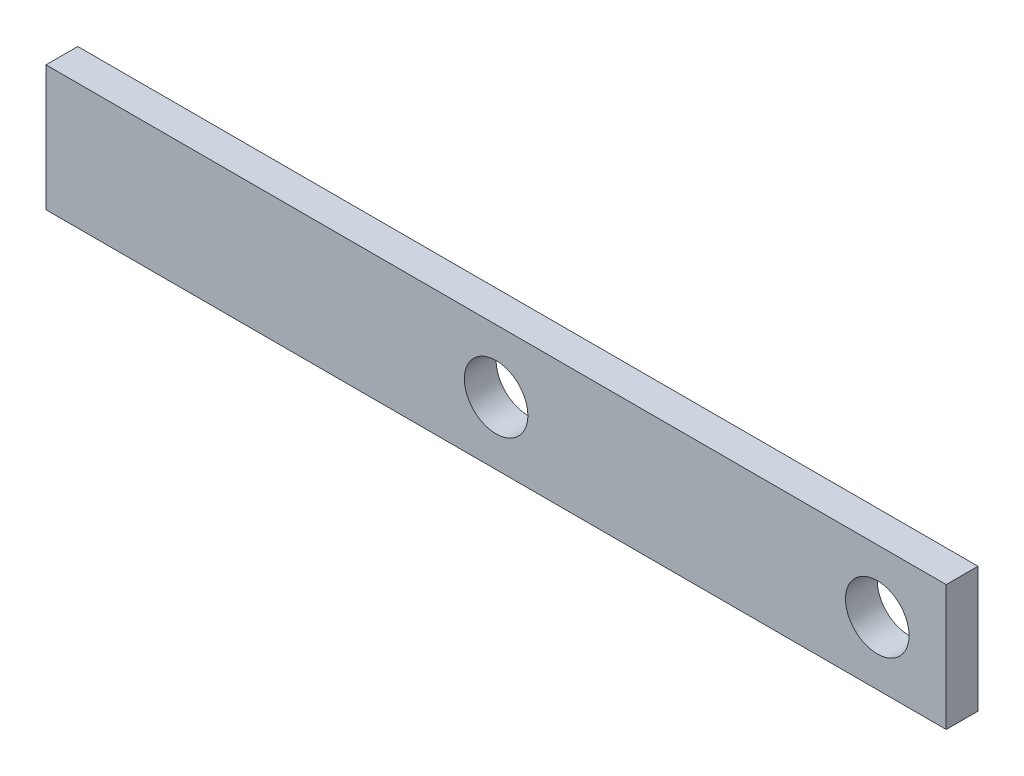
ISO-10303-21;
HEADER;
FILE_DESCRIPTION(('STEP AP214'),'2;1');
FILE_NAME('part.step','',(''),(''),'','','');
FILE_SCHEMA(('AUTOMOTIVE_DESIGN { 1 0 10303 214 1 1 1 1 }'));
ENDSEC;
DATA;
#1=APPLICATION_CONTEXT('core data for automotive mechanical design processes');
#2=APPLICATION_PROTOCOL_DEFINITION('international standard','automotive_design',2000,#1);
#3=PRODUCT_CONTEXT('',#1,'mechanical');
#4=PRODUCT('Part','Part','',(#3));
#5=PRODUCT_RELATED_PRODUCT_CATEGORY('part','',(#4));
#6=PRODUCT_DEFINITION_FORMATION('','',#4);
#7=PRODUCT_DEFINITION_CONTEXT('part definition',#1,'design');
#8=PRODUCT_DEFINITION('design','',#6,#7);
#9=PRODUCT_DEFINITION_SHAPE('','',#8);
#10=(LENGTH_UNIT() NAMED_UNIT(*) SI_UNIT(.MILLI.,.METRE.));
#11=(NAMED_UNIT(*) PLANE_ANGLE_UNIT() SI_UNIT($,.RADIAN.));
#12=(NAMED_UNIT(*) SI_UNIT($,.STERADIAN.) SOLID_ANGLE_UNIT());
#13=UNCERTAINTY_MEASURE_WITH_UNIT(LENGTH_MEASURE(1.E-05),#10,'distance_accuracy_value','');
#14=(GEOMETRIC_REPRESENTATION_CONTEXT(3) GLOBAL_UNCERTAINTY_ASSIGNED_CONTEXT((#13)) GLOBAL_UNIT_ASSIGNED_CONTEXT((#10,
#11,#12)) REPRESENTATION_CONTEXT('',''));
#15=CARTESIAN_POINT('',(0.,0.,0.));
#16=DIRECTION('',(0.,0.,1.));
#17=DIRECTION('',(1.,0.,0.));
#18=AXIS2_PLACEMENT_3D('',#15,#16,#17);
#19=CARTESIAN_POINT('',(0.,0.,10.));
#20=DIRECTION('',(0.,0.,1.));
#21=DIRECTION('',(1.,0.,0.));
#22=AXIS2_PLACEMENT_3D('',#19,#20,#21);
#23=PLANE('',#22);
#24=CARTESIAN_POINT('',(0.,0.,10.));
#25=DIRECTION('',(0.,0.,1.));
#26=DIRECTION('',(1.,0.,0.));
#27=AXIS2_PLACEMENT_3D('',#24,#25,#26);
#28=CIRCLE('',#27,10.);
#29=CARTESIAN_POINT('',(10.,0.,10.));
#30=VERTEX_POINT('',#29);
#31=EDGE_CURVE('E100',#30,#30,#28,.T.);
#32=ORIENTED_EDGE('',*,*,#31,.F.);
#33=EDGE_LOOP('',(#32));
#34=FACE_BOUND('',#33,.T.);
#35=DIRECTION('',(0.,1.,0.));
#36=VECTOR('',#35,1.);
#37=CARTESIAN_POINT('',(141.706502184528,19.7562751649105,10.));
#38=LINE('',#37,#36);
#39=CARTESIAN_POINT('',(141.706502184528,-19.7562751649105,10.));
#40=VERTEX_POINT('',#39);
#41=CARTESIAN_POINT('',(141.706502184528,19.7562751649105,10.));
#42=VERTEX_POINT('',#41);
#43=EDGE_CURVE('E85',#40,#42,#38,.T.);
#44=ORIENTED_EDGE('',*,*,#43,.T.);
#45=DIRECTION('',(-1.,0.,0.));
#46=VECTOR('',#45,1.);
#47=CARTESIAN_POINT('',(-141.706502184528,19.7562751649105,10.));
#48=LINE('',#47,#46);
#49=CARTESIAN_POINT('',(-141.706502184528,19.7562751649105,10.));
#50=VERTEX_POINT('',#49);
#51=EDGE_CURVE('E80',#42,#50,#48,.T.);
#52=ORIENTED_EDGE('',*,*,#51,.T.);
#53=DIRECTION('',(0.,-1.,0.));
#54=VECTOR('',#53,1.);
#55=CARTESIAN_POINT('',(-141.706502184528,19.7562751649105,10.));
#56=LINE('',#55,#54);
#57=CARTESIAN_POINT('',(-141.706502184528,-19.7562751649105,10.));
#58=VERTEX_POINT('',#57);
#59=EDGE_CURVE('E83',#50,#58,#56,.T.);
#60=ORIENTED_EDGE('',*,*,#59,.T.);
#61=DIRECTION('',(1.,0.,0.));
#62=VECTOR('',#61,1.);
#63=CARTESIAN_POINT('',(-141.706502184528,-19.7562751649105,10.));
#64=LINE('',#63,#62);
#65=EDGE_CURVE('E50',#58,#40,#64,.T.);
#66=ORIENTED_EDGE('',*,*,#65,.T.);
#67=EDGE_LOOP('',(#44,#52,#60,#66));
#68=FACE_BOUND('',#67,.T.);
#69=CARTESIAN_POINT('',(120.,0.,10.));
#70=DIRECTION('',(0.,0.,1.));
#71=DIRECTION('',(1.,0.,0.));
#72=AXIS2_PLACEMENT_3D('',#69,#70,#71);
#73=CIRCLE('',#72,10.);
#74=CARTESIAN_POINT('',(130.,0.,10.));
#75=VERTEX_POINT('',#74);
#76=EDGE_CURVE('E115',#75,#75,#73,.T.);
#77=ORIENTED_EDGE('',*,*,#76,.F.);
#78=EDGE_LOOP('',(#77));
#79=FACE_BOUND('',#78,.T.);
#80=ADVANCED_FACE('F33',(#34,#68,#79),#23,.T.);
#81=CARTESIAN_POINT('',(0.,0.,0.));
#82=DIRECTION('',(0.,0.,1.));
#83=DIRECTION('',(1.,0.,0.));
#84=AXIS2_PLACEMENT_3D('',#81,#82,#83);
#85=PLANE('',#84);
#86=DIRECTION('',(0.,1.,0.));
#87=VECTOR('',#86,1.);
#88=CARTESIAN_POINT('',(141.706502184528,19.7562751649105,0.));
#89=LINE('',#88,#87);
#90=CARTESIAN_POINT('',(141.706502184528,-19.7562751649105,0.));
#91=VERTEX_POINT('',#90);
#92=CARTESIAN_POINT('',(141.706502184528,19.7562751649105,0.));
#93=VERTEX_POINT('',#92);
#94=EDGE_CURVE('E97',#91,#93,#89,.T.);
#95=ORIENTED_EDGE('',*,*,#94,.F.);
#96=DIRECTION('',(1.,0.,0.));
#97=VECTOR('',#96,1.);
#98=CARTESIAN_POINT('',(-141.706502184528,-19.7562751649105,0.));
#99=LINE('',#98,#97);
#100=CARTESIAN_POINT('',(-141.706502184528,-19.7562751649105,0.));
#101=VERTEX_POINT('',#100);
#102=EDGE_CURVE('E73',#101,#91,#99,.T.);
#103=ORIENTED_EDGE('',*,*,#102,.F.);
#104=DIRECTION('',(0.,-1.,0.));
#105=VECTOR('',#104,1.);
#106=CARTESIAN_POINT('',(-141.706502184528,19.7562751649105,0.));
#107=LINE('',#106,#105);
#108=CARTESIAN_POINT('',(-141.706502184528,19.7562751649105,0.));
#109=VERTEX_POINT('',#108);
#110=EDGE_CURVE('E67',#109,#101,#107,.T.);
#111=ORIENTED_EDGE('',*,*,#110,.F.);
#112=DIRECTION('',(-1.,0.,0.));
#113=VECTOR('',#112,1.);
#114=CARTESIAN_POINT('',(-141.706502184528,19.7562751649105,0.));
#115=LINE('',#114,#113);
#116=EDGE_CURVE('E89',#93,#109,#115,.T.);
#117=ORIENTED_EDGE('',*,*,#116,.F.);
#118=EDGE_LOOP('',(#95,#103,#111,#117));
#119=FACE_BOUND('',#118,.T.);
#120=CARTESIAN_POINT('',(0.,0.,0.));
#121=DIRECTION('',(0.,0.,1.));
#122=DIRECTION('',(1.,0.,0.));
#123=AXIS2_PLACEMENT_3D('',#120,#121,#122);
#124=CIRCLE('',#123,10.);
#125=CARTESIAN_POINT('',(10.,0.,0.));
#126=VERTEX_POINT('',#125);
#127=EDGE_CURVE('E112',#126,#126,#124,.T.);
#128=ORIENTED_EDGE('',*,*,#127,.T.);
#129=EDGE_LOOP('',(#128));
#130=FACE_BOUND('',#129,.T.);
#131=CARTESIAN_POINT('',(120.,0.,0.));
#132=DIRECTION('',(0.,0.,1.));
#133=DIRECTION('',(1.,0.,0.));
#134=AXIS2_PLACEMENT_3D('',#131,#132,#133);
#135=CIRCLE('',#134,10.);
#136=CARTESIAN_POINT('',(130.,0.,0.));
#137=VERTEX_POINT('',#136);
#138=EDGE_CURVE('E118',#137,#137,#135,.T.);
#139=ORIENTED_EDGE('',*,*,#138,.T.);
#140=EDGE_LOOP('',(#139));
#141=FACE_BOUND('',#140,.T.);
#142=ADVANCED_FACE('F108',(#119,#130,#141),#85,.F.);
#143=CARTESIAN_POINT('',(141.706502184528,19.7562751649105,10.));
#144=DIRECTION('',(-1.,0.,0.));
#145=DIRECTION('',(0.,0.,1.));
#146=AXIS2_PLACEMENT_3D('',#143,#144,#145);
#147=PLANE('',#146);
#148=ORIENTED_EDGE('',*,*,#94,.T.);
#149=DIRECTION('',(0.,0.,-1.));
#150=VECTOR('',#149,1.);
#151=CARTESIAN_POINT('',(141.706502184528,19.7562751649105,10.));
#152=LINE('',#151,#150);
#153=EDGE_CURVE('E11',#42,#93,#152,.T.);
#154=ORIENTED_EDGE('',*,*,#153,.F.);
#155=ORIENTED_EDGE('',*,*,#43,.F.);
#156=DIRECTION('',(0.,0.,-1.));
#157=VECTOR('',#156,1.);
#158=CARTESIAN_POINT('',(141.706502184528,-19.7562751649105,10.));
#159=LINE('',#158,#157);
#160=EDGE_CURVE('E93',#40,#91,#159,.T.);
#161=ORIENTED_EDGE('',*,*,#160,.T.);
#162=EDGE_LOOP('',(#148,#154,#155,#161));
#163=FACE_BOUND('',#162,.T.);
#164=ADVANCED_FACE('F35',(#163),#147,.F.);
#165=CARTESIAN_POINT('',(-141.706502184528,19.7562751649105,10.));
#166=DIRECTION('',(0.,-1.,0.));
#167=DIRECTION('',(0.,0.,-1.));
#168=AXIS2_PLACEMENT_3D('',#165,#166,#167);
#169=PLANE('',#168);
#170=ORIENTED_EDGE('',*,*,#116,.T.);
#171=DIRECTION('',(0.,0.,-1.));
#172=VECTOR('',#171,1.);
#173=CARTESIAN_POINT('',(-141.706502184528,19.7562751649105,10.));
#174=LINE('',#173,#172);
#175=EDGE_CURVE('E42',#50,#109,#174,.T.);
#176=ORIENTED_EDGE('',*,*,#175,.F.);
#177=ORIENTED_EDGE('',*,*,#51,.F.);
#178=ORIENTED_EDGE('',*,*,#153,.T.);
#179=EDGE_LOOP('',(#170,#176,#177,#178));
#180=FACE_BOUND('',#179,.T.);
#181=ADVANCED_FACE('F88',(#180),#169,.F.);
#182=CARTESIAN_POINT('',(-141.706502184528,19.7562751649105,10.));
#183=DIRECTION('',(1.,0.,0.));
#184=DIRECTION('',(0.,0.,-1.));
#185=AXIS2_PLACEMENT_3D('',#182,#183,#184);
#186=PLANE('',#185);
#187=ORIENTED_EDGE('',*,*,#110,.T.);
#188=DIRECTION('',(0.,0.,-1.));
#189=VECTOR('',#188,1.);
#190=CARTESIAN_POINT('',(-141.706502184528,-19.7562751649105,10.));
#191=LINE('',#190,#189);
#192=EDGE_CURVE('E90',#58,#101,#191,.T.);
#193=ORIENTED_EDGE('',*,*,#192,.F.);
#194=ORIENTED_EDGE('',*,*,#59,.F.);
#195=ORIENTED_EDGE('',*,*,#175,.T.);
#196=EDGE_LOOP('',(#187,#193,#194,#195));
#197=FACE_BOUND('',#196,.T.);
#198=ADVANCED_FACE('F91',(#197),#186,.F.);
#199=CARTESIAN_POINT('',(-141.706502184528,-19.7562751649105,10.));
#200=DIRECTION('',(0.,1.,0.));
#201=DIRECTION('',(0.,0.,1.));
#202=AXIS2_PLACEMENT_3D('',#199,#200,#201);
#203=PLANE('',#202);
#204=ORIENTED_EDGE('',*,*,#102,.T.);
#205=ORIENTED_EDGE('',*,*,#160,.F.);
#206=ORIENTED_EDGE('',*,*,#65,.F.);
#207=ORIENTED_EDGE('',*,*,#192,.T.);
#208=EDGE_LOOP('',(#204,#205,#206,#207));
#209=FACE_BOUND('',#208,.T.);
#210=ADVANCED_FACE('F105',(#209),#203,.F.);
#211=CARTESIAN_POINT('',(0.,0.,10.));
#212=DIRECTION('',(0.,0.,-1.));
#213=DIRECTION('',(-1.,0.,0.));
#214=AXIS2_PLACEMENT_3D('',#211,#212,#213);
#215=CYLINDRICAL_SURFACE('',#214,10.);
#216=ORIENTED_EDGE('',*,*,#31,.T.);
#217=EDGE_LOOP('',(#216));
#218=FACE_BOUND('',#217,.T.);
#219=ORIENTED_EDGE('',*,*,#127,.F.);
#220=EDGE_LOOP('',(#219));
#221=FACE_BOUND('',#220,.T.);
#222=ADVANCED_FACE('F135',(#218,#221),#215,.F.);
#223=CARTESIAN_POINT('',(120.,0.,10.));
#224=DIRECTION('',(0.,0.,-1.));
#225=DIRECTION('',(-1.,0.,0.));
#226=AXIS2_PLACEMENT_3D('',#223,#224,#225);
#227=CYLINDRICAL_SURFACE('',#226,10.);
#228=ORIENTED_EDGE('',*,*,#76,.T.);
#229=EDGE_LOOP('',(#228));
#230=FACE_BOUND('',#229,.T.);
#231=ORIENTED_EDGE('',*,*,#138,.F.);
#232=EDGE_LOOP('',(#231));
#233=FACE_BOUND('',#232,.T.);
#234=ADVANCED_FACE('F124',(#230,#233),#227,.F.);
#235=CLOSED_SHELL('',(#80,#142,#164,#181,#198,#210,#222,#234));
#236=MANIFOLD_SOLID_BREP('B2',#235);
#237=ADVANCED_BREP_SHAPE_REPRESENTATION('',(#18,#236),#14);
#238=SHAPE_DEFINITION_REPRESENTATION(#9,#237);
ENDSEC;
END-ISO-10303-21;
